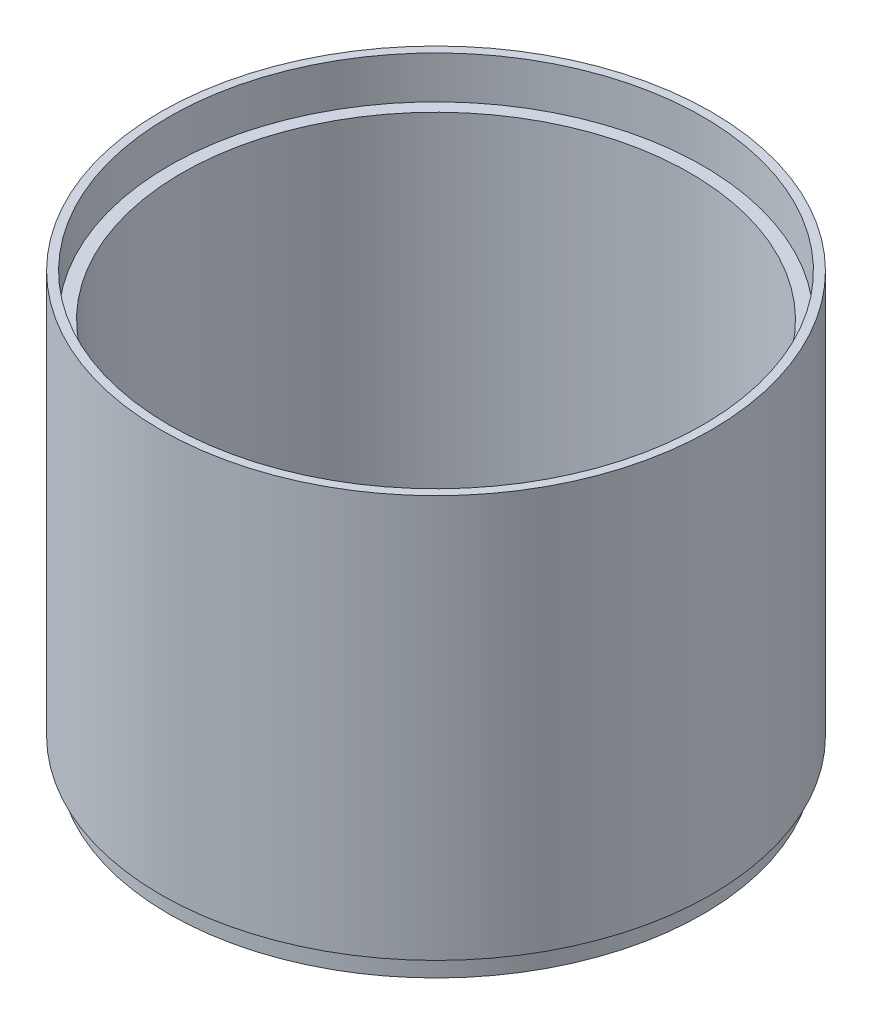
ISO-10303-21;
HEADER;
FILE_DESCRIPTION(('STEP AP214'),'2;1');
FILE_NAME('part.step','',(''),(''),'','','');
FILE_SCHEMA(('AUTOMOTIVE_DESIGN { 1 0 10303 214 1 1 1 1 }'));
ENDSEC;
DATA;
#1=APPLICATION_CONTEXT('core data for automotive mechanical design processes');
#2=APPLICATION_PROTOCOL_DEFINITION('international standard','automotive_design',2000,#1);
#3=PRODUCT_CONTEXT('',#1,'mechanical');
#4=PRODUCT('Part','Part','',(#3));
#5=PRODUCT_RELATED_PRODUCT_CATEGORY('part','',(#4));
#6=PRODUCT_DEFINITION_FORMATION('','',#4);
#7=PRODUCT_DEFINITION_CONTEXT('part definition',#1,'design');
#8=PRODUCT_DEFINITION('design','',#6,#7);
#9=PRODUCT_DEFINITION_SHAPE('','',#8);
#10=(LENGTH_UNIT() NAMED_UNIT(*) SI_UNIT(.MILLI.,.METRE.));
#11=(NAMED_UNIT(*) PLANE_ANGLE_UNIT() SI_UNIT($,.RADIAN.));
#12=(NAMED_UNIT(*) SI_UNIT($,.STERADIAN.) SOLID_ANGLE_UNIT());
#13=UNCERTAINTY_MEASURE_WITH_UNIT(LENGTH_MEASURE(1.E-05),#10,'distance_accuracy_value','');
#14=(GEOMETRIC_REPRESENTATION_CONTEXT(3) GLOBAL_UNCERTAINTY_ASSIGNED_CONTEXT((#13)) GLOBAL_UNIT_ASSIGNED_CONTEXT((#10,
#11,#12)) REPRESENTATION_CONTEXT('',''));
#15=CARTESIAN_POINT('',(0.,0.,0.));
#16=DIRECTION('',(0.,0.,1.));
#17=DIRECTION('',(1.,0.,0.));
#18=AXIS2_PLACEMENT_3D('',#15,#16,#17);
#19=CARTESIAN_POINT('',(0.,100.,0.));
#20=DIRECTION('',(0.,1.,0.));
#21=DIRECTION('',(0.,0.,1.));
#22=AXIS2_PLACEMENT_3D('',#19,#20,#21);
#23=PLANE('',#22);
#24=CARTESIAN_POINT('',(0.,100.,0.));
#25=DIRECTION('',(0.,1.,0.));
#26=DIRECTION('',(0.,0.,1.));
#27=AXIS2_PLACEMENT_3D('',#24,#25,#26);
#28=CIRCLE('',#27,65.);
#29=CARTESIAN_POINT('',(0.,100.,65.));
#30=VERTEX_POINT('',#29);
#31=EDGE_CURVE('E10',#30,#30,#28,.T.);
#32=ORIENTED_EDGE('',*,*,#31,.T.);
#33=EDGE_LOOP('',(#32));
#34=FACE_BOUND('',#33,.T.);
#35=CARTESIAN_POINT('',(0.,100.,0.));
#36=DIRECTION('',(0.,1.,0.));
#37=DIRECTION('',(0.,0.,1.));
#38=AXIS2_PLACEMENT_3D('',#35,#36,#37);
#39=CIRCLE('',#38,63.);
#40=CARTESIAN_POINT('',(0.,100.,63.));
#41=VERTEX_POINT('',#40);
#42=EDGE_CURVE('E67',#41,#41,#39,.T.);
#43=ORIENTED_EDGE('',*,*,#42,.F.);
#44=EDGE_LOOP('',(#43));
#45=FACE_BOUND('',#44,.T.);
#46=ADVANCED_FACE('F39',(#34,#45),#23,.T.);
#47=CARTESIAN_POINT('',(0.,35.5410399424626,0.));
#48=DIRECTION('',(0.,1.,0.));
#49=DIRECTION('',(0.,0.,1.));
#50=AXIS2_PLACEMENT_3D('',#47,#48,#49);
#51=CYLINDRICAL_SURFACE('',#50,65.);
#52=CARTESIAN_POINT('',(0.,5.,0.));
#53=DIRECTION('',(0.,1.,0.));
#54=DIRECTION('',(0.,0.,1.));
#55=AXIS2_PLACEMENT_3D('',#52,#53,#54);
#56=CIRCLE('',#55,65.);
#57=CARTESIAN_POINT('',(0.,5.,65.));
#58=VERTEX_POINT('',#57);
#59=EDGE_CURVE('E45',#58,#58,#56,.T.);
#60=ORIENTED_EDGE('',*,*,#59,.T.);
#61=EDGE_LOOP('',(#60));
#62=FACE_BOUND('',#61,.T.);
#63=ORIENTED_EDGE('',*,*,#31,.F.);
#64=EDGE_LOOP('',(#63));
#65=FACE_BOUND('',#64,.T.);
#66=ADVANCED_FACE('F75',(#62,#65),#51,.T.);
#67=CARTESIAN_POINT('',(0.,5.,0.));
#68=DIRECTION('',(0.,1.,0.));
#69=DIRECTION('',(0.,0.,1.));
#70=AXIS2_PLACEMENT_3D('',#67,#68,#69);
#71=PLANE('',#70);
#72=ORIENTED_EDGE('',*,*,#59,.F.);
#73=EDGE_LOOP('',(#72));
#74=FACE_BOUND('',#73,.T.);
#75=CARTESIAN_POINT('',(0.,5.,0.));
#76=DIRECTION('',(0.,1.,0.));
#77=DIRECTION('',(0.,0.,1.));
#78=AXIS2_PLACEMENT_3D('',#75,#76,#77);
#79=CIRCLE('',#78,63.);
#80=CARTESIAN_POINT('',(0.,5.,63.));
#81=VERTEX_POINT('',#80);
#82=EDGE_CURVE('E49',#81,#81,#79,.T.);
#83=ORIENTED_EDGE('',*,*,#82,.T.);
#84=EDGE_LOOP('',(#83));
#85=FACE_BOUND('',#84,.T.);
#86=ADVANCED_FACE('F79',(#74,#85),#71,.F.);
#87=CARTESIAN_POINT('',(0.,35.5410399424626,0.));
#88=DIRECTION('',(0.,1.,0.));
#89=DIRECTION('',(0.,0.,1.));
#90=AXIS2_PLACEMENT_3D('',#87,#88,#89);
#91=CYLINDRICAL_SURFACE('',#90,63.);
#92=ORIENTED_EDGE('',*,*,#82,.F.);
#93=EDGE_LOOP('',(#92));
#94=FACE_BOUND('',#93,.T.);
#95=CARTESIAN_POINT('',(0.,0.,0.));
#96=DIRECTION('',(0.,1.,0.));
#97=DIRECTION('',(0.,0.,1.));
#98=AXIS2_PLACEMENT_3D('',#95,#96,#97);
#99=CIRCLE('',#98,63.);
#100=CARTESIAN_POINT('',(0.,0.,63.));
#101=VERTEX_POINT('',#100);
#102=EDGE_CURVE('E53',#101,#101,#99,.T.);
#103=ORIENTED_EDGE('',*,*,#102,.T.);
#104=EDGE_LOOP('',(#103));
#105=FACE_BOUND('',#104,.T.);
#106=ADVANCED_FACE('F83',(#94,#105),#91,.T.);
#107=CARTESIAN_POINT('',(0.,0.,0.));
#108=DIRECTION('',(0.,-1.,0.));
#109=DIRECTION('',(0.,0.,-1.));
#110=AXIS2_PLACEMENT_3D('',#107,#108,#109);
#111=PLANE('',#110);
#112=CARTESIAN_POINT('',(0.,0.,0.));
#113=DIRECTION('',(0.,1.,0.));
#114=DIRECTION('',(0.,0.,1.));
#115=AXIS2_PLACEMENT_3D('',#112,#113,#114);
#116=CIRCLE('',#115,60.);
#117=CARTESIAN_POINT('',(0.,0.,60.));
#118=VERTEX_POINT('',#117);
#119=EDGE_CURVE('E58',#118,#118,#116,.T.);
#120=ORIENTED_EDGE('',*,*,#119,.T.);
#121=EDGE_LOOP('',(#120));
#122=FACE_BOUND('',#121,.T.);
#123=ORIENTED_EDGE('',*,*,#102,.F.);
#124=EDGE_LOOP('',(#123));
#125=FACE_BOUND('',#124,.T.);
#126=ADVANCED_FACE('F90',(#122,#125),#111,.T.);
#127=CARTESIAN_POINT('',(0.,35.5410399424626,0.));
#128=DIRECTION('',(0.,1.,0.));
#129=DIRECTION('',(0.,0.,1.));
#130=AXIS2_PLACEMENT_3D('',#127,#128,#129);
#131=CYLINDRICAL_SURFACE('',#130,60.);
#132=CARTESIAN_POINT('',(0.,90.,0.));
#133=DIRECTION('',(0.,1.,0.));
#134=DIRECTION('',(0.,0.,1.));
#135=AXIS2_PLACEMENT_3D('',#132,#133,#134);
#136=CIRCLE('',#135,60.);
#137=CARTESIAN_POINT('',(0.,90.,60.));
#138=VERTEX_POINT('',#137);
#139=EDGE_CURVE('E61',#138,#138,#136,.T.);
#140=ORIENTED_EDGE('',*,*,#139,.T.);
#141=EDGE_LOOP('',(#140));
#142=FACE_BOUND('',#141,.T.);
#143=ORIENTED_EDGE('',*,*,#119,.F.);
#144=EDGE_LOOP('',(#143));
#145=FACE_BOUND('',#144,.T.);
#146=ADVANCED_FACE('F94',(#142,#145),#131,.F.);
#147=CARTESIAN_POINT('',(0.,90.,0.));
#148=DIRECTION('',(0.,1.,0.));
#149=DIRECTION('',(0.,0.,1.));
#150=AXIS2_PLACEMENT_3D('',#147,#148,#149);
#151=PLANE('',#150);
#152=CARTESIAN_POINT('',(0.,90.,0.));
#153=DIRECTION('',(0.,1.,0.));
#154=DIRECTION('',(0.,0.,1.));
#155=AXIS2_PLACEMENT_3D('',#152,#153,#154);
#156=CIRCLE('',#155,63.);
#157=CARTESIAN_POINT('',(0.,90.,63.));
#158=VERTEX_POINT('',#157);
#159=EDGE_CURVE('E64',#158,#158,#156,.T.);
#160=ORIENTED_EDGE('',*,*,#159,.T.);
#161=EDGE_LOOP('',(#160));
#162=FACE_BOUND('',#161,.T.);
#163=ORIENTED_EDGE('',*,*,#139,.F.);
#164=EDGE_LOOP('',(#163));
#165=FACE_BOUND('',#164,.T.);
#166=ADVANCED_FACE('F98',(#162,#165),#151,.T.);
#167=CARTESIAN_POINT('',(0.,35.5410399424626,0.));
#168=DIRECTION('',(0.,1.,0.));
#169=DIRECTION('',(0.,0.,1.));
#170=AXIS2_PLACEMENT_3D('',#167,#168,#169);
#171=CYLINDRICAL_SURFACE('',#170,63.);
#172=ORIENTED_EDGE('',*,*,#42,.T.);
#173=EDGE_LOOP('',(#172));
#174=FACE_BOUND('',#173,.T.);
#175=ORIENTED_EDGE('',*,*,#159,.F.);
#176=EDGE_LOOP('',(#175));
#177=FACE_BOUND('',#176,.T.);
#178=ADVANCED_FACE('F71',(#174,#177),#171,.F.);
#179=CLOSED_SHELL('',(#46,#66,#86,#106,#126,#146,#166,#178));
#180=MANIFOLD_SOLID_BREP('B2',#179);
#181=ADVANCED_BREP_SHAPE_REPRESENTATION('',(#18,#180),#14);
#182=SHAPE_DEFINITION_REPRESENTATION(#9,#181);
ENDSEC;
END-ISO-10303-21;
